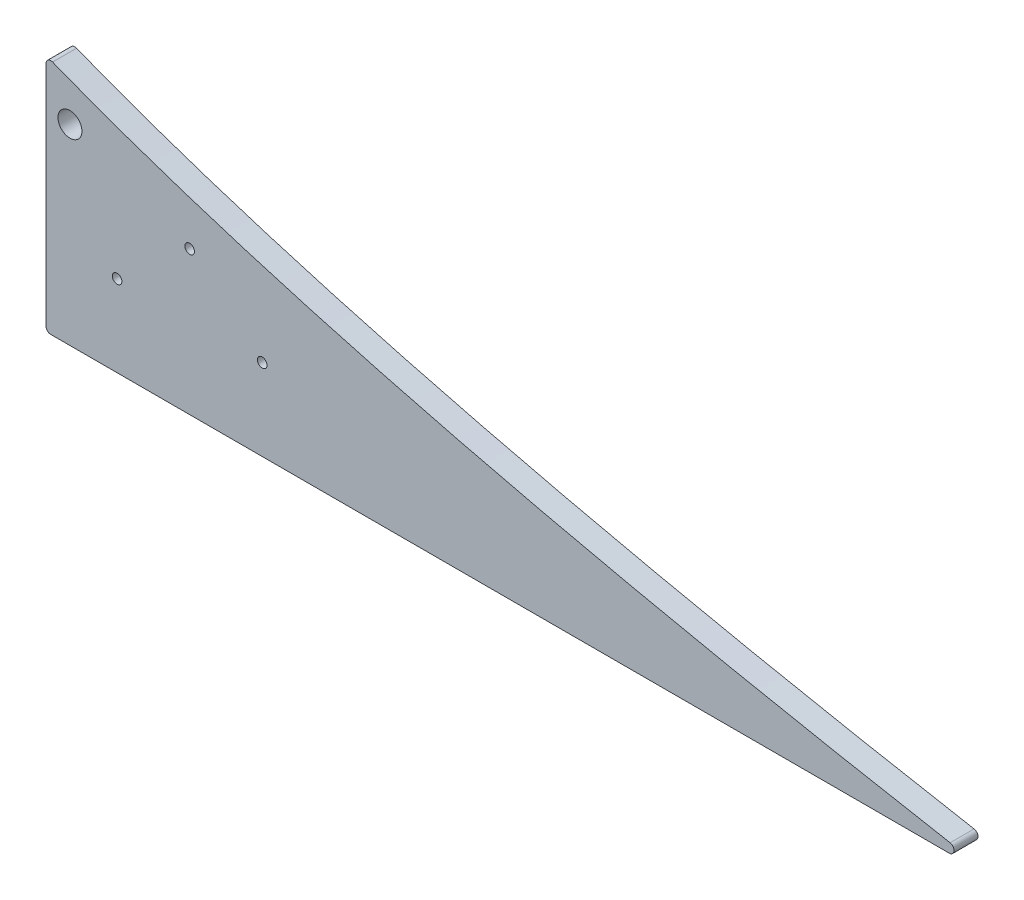
ISO-10303-21;
HEADER;
FILE_DESCRIPTION(('STEP AP214'),'2;1');
FILE_NAME('part.step','',(''),(''),'','','');
FILE_SCHEMA(('AUTOMOTIVE_DESIGN { 1 0 10303 214 1 1 1 1 }'));
ENDSEC;
DATA;
#1=APPLICATION_CONTEXT('core data for automotive mechanical design processes');
#2=APPLICATION_PROTOCOL_DEFINITION('international standard','automotive_design',2000,#1);
#3=PRODUCT_CONTEXT('',#1,'mechanical');
#4=PRODUCT('Part','Part','',(#3));
#5=PRODUCT_RELATED_PRODUCT_CATEGORY('part','',(#4));
#6=PRODUCT_DEFINITION_FORMATION('','',#4);
#7=PRODUCT_DEFINITION_CONTEXT('part definition',#1,'design');
#8=PRODUCT_DEFINITION('design','',#6,#7);
#9=PRODUCT_DEFINITION_SHAPE('','',#8);
#10=(LENGTH_UNIT() NAMED_UNIT(*) SI_UNIT(.MILLI.,.METRE.));
#11=(NAMED_UNIT(*) PLANE_ANGLE_UNIT() SI_UNIT($,.RADIAN.));
#12=(NAMED_UNIT(*) SI_UNIT($,.STERADIAN.) SOLID_ANGLE_UNIT());
#13=UNCERTAINTY_MEASURE_WITH_UNIT(LENGTH_MEASURE(1.E-05),#10,'distance_accuracy_value','');
#14=(GEOMETRIC_REPRESENTATION_CONTEXT(3) GLOBAL_UNCERTAINTY_ASSIGNED_CONTEXT((#13)) GLOBAL_UNIT_ASSIGNED_CONTEXT((#10,
#11,#12)) REPRESENTATION_CONTEXT('',''));
#15=CARTESIAN_POINT('',(0.,0.,0.));
#16=DIRECTION('',(0.,0.,1.));
#17=DIRECTION('',(1.,0.,0.));
#18=AXIS2_PLACEMENT_3D('',#15,#16,#17);
#19=CARTESIAN_POINT('',(211.923486022132,61.2903568455649,12.7));
#20=DIRECTION('',(0.,0.,-1.));
#21=DIRECTION('',(-1.,0.,0.));
#22=AXIS2_PLACEMENT_3D('',#19,#20,#21);
#23=PLANE('',#22);
#24=CARTESIAN_POINT('',(114.69116,43.20032,12.7));
#25=DIRECTION('',(0.,0.,1.));
#26=DIRECTION('',(1.,0.,0.));
#27=AXIS2_PLACEMENT_3D('',#24,#25,#26);
#28=CIRCLE('',#27,2.54);
#29=CARTESIAN_POINT('',(117.23116,43.20032,12.7));
#30=VERTEX_POINT('',#29);
#31=EDGE_CURVE('E151',#30,#30,#28,.T.);
#32=ORIENTED_EDGE('',*,*,#31,.F.);
#33=EDGE_LOOP('',(#32));
#34=FACE_BOUND('',#33,.T.);
#35=CARTESIAN_POINT('',(37.70884,43.20032,12.7));
#36=DIRECTION('',(0.,0.,1.));
#37=DIRECTION('',(1.,0.,0.));
#38=AXIS2_PLACEMENT_3D('',#35,#36,#37);
#39=CIRCLE('',#38,2.53999999999999);
#40=CARTESIAN_POINT('',(40.24884,43.20032,12.7));
#41=VERTEX_POINT('',#40);
#42=EDGE_CURVE('E141',#41,#41,#39,.T.);
#43=ORIENTED_EDGE('',*,*,#42,.F.);
#44=EDGE_LOOP('',(#43));
#45=FACE_BOUND('',#44,.T.);
#46=CARTESIAN_POINT('',(76.2,76.2,12.7));
#47=DIRECTION('',(0.,0.,1.));
#48=DIRECTION('',(1.,0.,0.));
#49=AXIS2_PLACEMENT_3D('',#46,#47,#48);
#50=CIRCLE('',#49,2.53999999999999);
#51=CARTESIAN_POINT('',(78.74,76.2,12.7));
#52=VERTEX_POINT('',#51);
#53=EDGE_CURVE('E138',#52,#52,#50,.T.);
#54=ORIENTED_EDGE('',*,*,#53,.F.);
#55=EDGE_LOOP('',(#54));
#56=FACE_BOUND('',#55,.T.);
#57=DIRECTION('',(0.,-1.,0.));
#58=VECTOR('',#57,1.);
#59=CARTESIAN_POINT('',(0.,0.,12.7));
#60=LINE('',#59,#58);
#61=CARTESIAN_POINT('',(0.,123.256640408703,12.7));
#62=VERTEX_POINT('',#61);
#63=CARTESIAN_POINT('',(0.,2.54,12.7));
#64=VERTEX_POINT('',#63);
#65=EDGE_CURVE('E104',#62,#64,#60,.T.);
#66=ORIENTED_EDGE('',*,*,#65,.T.);
#67=CARTESIAN_POINT('',(2.53999999999999,2.54,12.7));
#68=DIRECTION('',(0.,0.,-1.));
#69=DIRECTION('',(-1.,0.,0.));
#70=AXIS2_PLACEMENT_3D('',#67,#68,#69);
#71=CIRCLE('',#70,2.54);
#72=CARTESIAN_POINT('',(2.53999999999999,0.,12.7));
#73=VERTEX_POINT('',#72);
#74=EDGE_CURVE('E41',#64,#73,#71,.F.);
#75=ORIENTED_EDGE('',*,*,#74,.T.);
#76=DIRECTION('',(1.,0.,0.));
#77=VECTOR('',#76,1.);
#78=CARTESIAN_POINT('',(508.,0.,12.7));
#79=LINE('',#78,#77);
#80=CARTESIAN_POINT('',(479.099890022975,0.,12.7));
#81=VERTEX_POINT('',#80);
#82=EDGE_CURVE('E110',#73,#81,#79,.T.);
#83=ORIENTED_EDGE('',*,*,#82,.T.);
#84=CARTESIAN_POINT('',(479.099890022975,2.54000000000003,12.7));
#85=DIRECTION('',(0.,0.,-1.));
#86=DIRECTION('',(-1.,0.,0.));
#87=AXIS2_PLACEMENT_3D('',#84,#85,#86);
#88=CIRCLE('',#87,2.54);
#89=CARTESIAN_POINT('',(479.548959203002,5.03998737427818,12.7));
#90=VERTEX_POINT('',#89);
#91=EDGE_CURVE('E49',#81,#90,#88,.F.);
#92=ORIENTED_EDGE('',*,*,#91,.T.);
#93=CARTESIAN_POINT('',(508.000000000001,-1.04948429841887E-13,12.7));
#94=CARTESIAN_POINT('',(169.846972044265,59.0807136911298,12.7));
#95=CARTESIAN_POINT('',(0.,127.,12.7));
#96=B_SPLINE_CURVE_WITH_KNOTS('',2,(#93,#94,#95),.UNSPECIFIED.,.F.,.F.,(3,3),(0.,1.),.UNSPECIFIED.);
#97=CARTESIAN_POINT('',(3.47389515778096,125.6187241994,12.7));
#98=VERTEX_POINT('',#97);
#99=EDGE_CURVE('E113',#90,#98,#96,.T.);
#100=ORIENTED_EDGE('',*,*,#99,.T.);
#101=CARTESIAN_POINT('',(2.54,123.256640408703,12.7));
#102=DIRECTION('',(0.,0.,-1.));
#103=DIRECTION('',(-1.,0.,0.));
#104=AXIS2_PLACEMENT_3D('',#101,#102,#103);
#105=CIRCLE('',#104,2.54);
#106=EDGE_CURVE('E122',#98,#62,#105,.F.);
#107=ORIENTED_EDGE('',*,*,#106,.T.);
#108=EDGE_LOOP('',(#66,#75,#83,#92,#100,#107));
#109=FACE_BOUND('',#108,.T.);
#110=CARTESIAN_POINT('',(12.7,101.6,12.7));
#111=DIRECTION('',(0.,0.,1.));
#112=DIRECTION('',(1.,0.,0.));
#113=AXIS2_PLACEMENT_3D('',#110,#111,#112);
#114=CIRCLE('',#113,6.35);
#115=CARTESIAN_POINT('',(19.05,101.6,12.7));
#116=VERTEX_POINT('',#115);
#117=EDGE_CURVE('E154',#116,#116,#114,.T.);
#118=ORIENTED_EDGE('',*,*,#117,.F.);
#119=EDGE_LOOP('',(#118));
#120=FACE_BOUND('',#119,.T.);
#121=ADVANCED_FACE('F32',(#34,#45,#56,#109,#120),#23,.F.);
#122=CARTESIAN_POINT('',(211.923486022132,61.2903568455649,0.));
#123=DIRECTION('',(0.,0.,-1.));
#124=DIRECTION('',(-1.,0.,0.));
#125=AXIS2_PLACEMENT_3D('',#122,#123,#124);
#126=PLANE('',#125);
#127=CARTESIAN_POINT('',(114.69116,43.20032,0.));
#128=DIRECTION('',(0.,0.,-1.));
#129=DIRECTION('',(-1.,0.,0.));
#130=AXIS2_PLACEMENT_3D('',#127,#128,#129);
#131=CIRCLE('',#130,2.54);
#132=CARTESIAN_POINT('',(112.15116,43.20032,0.));
#133=VERTEX_POINT('',#132);
#134=EDGE_CURVE('E36',#133,#133,#131,.T.);
#135=ORIENTED_EDGE('',*,*,#134,.F.);
#136=EDGE_LOOP('',(#135));
#137=FACE_BOUND('',#136,.T.);
#138=CARTESIAN_POINT('',(37.70884,43.20032,0.));
#139=DIRECTION('',(0.,0.,-1.));
#140=DIRECTION('',(-1.,0.,0.));
#141=AXIS2_PLACEMENT_3D('',#138,#139,#140);
#142=CIRCLE('',#141,2.53999999999999);
#143=CARTESIAN_POINT('',(35.16884,43.20032,0.));
#144=VERTEX_POINT('',#143);
#145=EDGE_CURVE('E139',#144,#144,#142,.T.);
#146=ORIENTED_EDGE('',*,*,#145,.F.);
#147=EDGE_LOOP('',(#146));
#148=FACE_BOUND('',#147,.T.);
#149=CARTESIAN_POINT('',(76.2,76.2,0.));
#150=DIRECTION('',(0.,0.,-1.));
#151=DIRECTION('',(-1.,0.,0.));
#152=AXIS2_PLACEMENT_3D('',#149,#150,#151);
#153=CIRCLE('',#152,2.53999999999999);
#154=CARTESIAN_POINT('',(73.66,76.2,0.));
#155=VERTEX_POINT('',#154);
#156=EDGE_CURVE('E135',#155,#155,#153,.T.);
#157=ORIENTED_EDGE('',*,*,#156,.F.);
#158=EDGE_LOOP('',(#157));
#159=FACE_BOUND('',#158,.T.);
#160=DIRECTION('',(1.,0.,0.));
#161=VECTOR('',#160,1.);
#162=CARTESIAN_POINT('',(508.,0.,0.));
#163=LINE('',#162,#161);
#164=CARTESIAN_POINT('',(2.53999999999999,0.,0.));
#165=VERTEX_POINT('',#164);
#166=CARTESIAN_POINT('',(479.099890022975,0.,0.));
#167=VERTEX_POINT('',#166);
#168=EDGE_CURVE('E115',#165,#167,#163,.T.);
#169=ORIENTED_EDGE('',*,*,#168,.F.);
#170=CARTESIAN_POINT('',(2.53999999999999,2.54,0.));
#171=DIRECTION('',(0.,0.,-1.));
#172=DIRECTION('',(-1.,0.,0.));
#173=AXIS2_PLACEMENT_3D('',#170,#171,#172);
#174=CIRCLE('',#173,2.54);
#175=CARTESIAN_POINT('',(0.,2.54,0.));
#176=VERTEX_POINT('',#175);
#177=EDGE_CURVE('E109',#165,#176,#174,.T.);
#178=ORIENTED_EDGE('',*,*,#177,.T.);
#179=DIRECTION('',(0.,-1.,0.));
#180=VECTOR('',#179,1.);
#181=CARTESIAN_POINT('',(0.,0.,0.));
#182=LINE('',#181,#180);
#183=CARTESIAN_POINT('',(0.,123.256640408703,0.));
#184=VERTEX_POINT('',#183);
#185=EDGE_CURVE('E103',#184,#176,#182,.T.);
#186=ORIENTED_EDGE('',*,*,#185,.F.);
#187=CARTESIAN_POINT('',(2.54,123.256640408703,0.));
#188=DIRECTION('',(0.,0.,-1.));
#189=DIRECTION('',(-1.,0.,0.));
#190=AXIS2_PLACEMENT_3D('',#187,#188,#189);
#191=CIRCLE('',#190,2.54);
#192=CARTESIAN_POINT('',(3.47389515778096,125.6187241994,0.));
#193=VERTEX_POINT('',#192);
#194=EDGE_CURVE('E91',#184,#193,#191,.T.);
#195=ORIENTED_EDGE('',*,*,#194,.T.);
#196=CARTESIAN_POINT('',(508.000000000001,-1.04948429841887E-13,0.));
#197=CARTESIAN_POINT('',(169.846972044265,59.0807136911298,0.));
#198=CARTESIAN_POINT('',(0.,127.,0.));
#199=B_SPLINE_CURVE_WITH_KNOTS('',2,(#196,#197,#198),.UNSPECIFIED.,.F.,.F.,(3,3),(0.,1.),.UNSPECIFIED.);
#200=CARTESIAN_POINT('',(479.548959203001,5.03998737427819,0.));
#201=VERTEX_POINT('',#200);
#202=EDGE_CURVE('E111',#201,#193,#199,.T.);
#203=ORIENTED_EDGE('',*,*,#202,.F.);
#204=CARTESIAN_POINT('',(479.099890022975,2.54000000000003,0.));
#205=DIRECTION('',(0.,0.,-1.));
#206=DIRECTION('',(-1.,0.,0.));
#207=AXIS2_PLACEMENT_3D('',#204,#205,#206);
#208=CIRCLE('',#207,2.54);
#209=EDGE_CURVE('E129',#201,#167,#208,.T.);
#210=ORIENTED_EDGE('',*,*,#209,.T.);
#211=EDGE_LOOP('',(#169,#178,#186,#195,#203,#210));
#212=FACE_BOUND('',#211,.T.);
#213=CARTESIAN_POINT('',(12.7,101.6,0.));
#214=DIRECTION('',(0.,0.,1.));
#215=DIRECTION('',(1.,0.,0.));
#216=AXIS2_PLACEMENT_3D('',#213,#214,#215);
#217=CIRCLE('',#216,6.35);
#218=CARTESIAN_POINT('',(19.05,101.6,0.));
#219=VERTEX_POINT('',#218);
#220=EDGE_CURVE('E137',#219,#219,#217,.T.);
#221=ORIENTED_EDGE('',*,*,#220,.T.);
#222=EDGE_LOOP('',(#221));
#223=FACE_BOUND('',#222,.T.);
#224=ADVANCED_FACE('F107',(#137,#148,#159,#212,#223),#126,.T.);
#225=CARTESIAN_POINT('',(508.,0.,12.7));
#226=DIRECTION('',(0.,1.,0.));
#227=DIRECTION('',(-1.,0.,0.));
#228=AXIS2_PLACEMENT_3D('',#225,#226,#227);
#229=PLANE('',#228);
#230=ORIENTED_EDGE('',*,*,#82,.F.);
#231=DIRECTION('',(0.,0.,-1.));
#232=VECTOR('',#231,1.);
#233=CARTESIAN_POINT('',(2.53999999999999,0.,12.7));
#234=LINE('',#233,#232);
#235=EDGE_CURVE('E126',#73,#165,#234,.T.);
#236=ORIENTED_EDGE('',*,*,#235,.T.);
#237=ORIENTED_EDGE('',*,*,#168,.T.);
#238=DIRECTION('',(0.,0.,-1.));
#239=VECTOR('',#238,1.);
#240=CARTESIAN_POINT('',(479.099890022975,0.,12.7));
#241=LINE('',#240,#239);
#242=EDGE_CURVE('E124',#167,#81,#241,.F.);
#243=ORIENTED_EDGE('',*,*,#242,.T.);
#244=EDGE_LOOP('',(#230,#236,#237,#243));
#245=FACE_BOUND('',#244,.T.);
#246=ADVANCED_FACE('F171',(#245),#229,.F.);
#247=DIRECTION('',(0.,0.,-1.));
#248=VECTOR('',#247,1.);
#249=SURFACE_OF_LINEAR_EXTRUSION('',#96,#248);
#250=ORIENTED_EDGE('',*,*,#99,.F.);
#251=DIRECTION('',(0.,0.,-1.));
#252=VECTOR('',#251,1.);
#253=CARTESIAN_POINT('',(479.548959203002,5.03998737427818,12.7));
#254=LINE('',#253,#252);
#255=EDGE_CURVE('E11',#90,#201,#254,.T.);
#256=ORIENTED_EDGE('',*,*,#255,.T.);
#257=ORIENTED_EDGE('',*,*,#202,.T.);
#258=DIRECTION('',(0.,0.,-1.));
#259=VECTOR('',#258,1.);
#260=CARTESIAN_POINT('',(3.47389515778077,125.6187241994,0.));
#261=LINE('',#260,#259);
#262=EDGE_CURVE('E97',#193,#98,#261,.F.);
#263=ORIENTED_EDGE('',*,*,#262,.T.);
#264=EDGE_LOOP('',(#250,#256,#257,#263));
#265=FACE_BOUND('',#264,.T.);
#266=ADVANCED_FACE('F167',(#265),#249,.F.);
#267=CARTESIAN_POINT('',(0.,0.,12.7));
#268=DIRECTION('',(1.,0.,0.));
#269=DIRECTION('',(0.,0.,-1.));
#270=AXIS2_PLACEMENT_3D('',#267,#268,#269);
#271=PLANE('',#270);
#272=ORIENTED_EDGE('',*,*,#185,.T.);
#273=DIRECTION('',(0.,0.,-1.));
#274=VECTOR('',#273,1.);
#275=CARTESIAN_POINT('',(0.,2.54,12.7));
#276=LINE('',#275,#274);
#277=EDGE_CURVE('E57',#176,#64,#276,.F.);
#278=ORIENTED_EDGE('',*,*,#277,.T.);
#279=ORIENTED_EDGE('',*,*,#65,.F.);
#280=DIRECTION('',(0.,0.,-1.));
#281=VECTOR('',#280,1.);
#282=CARTESIAN_POINT('',(0.,123.256640408703,12.7));
#283=LINE('',#282,#281);
#284=EDGE_CURVE('E95',#62,#184,#283,.T.);
#285=ORIENTED_EDGE('',*,*,#284,.T.);
#286=EDGE_LOOP('',(#272,#278,#279,#285));
#287=FACE_BOUND('',#286,.T.);
#288=ADVANCED_FACE('F102',(#287),#271,.F.);
#289=CARTESIAN_POINT('',(12.7,101.6,12.7));
#290=DIRECTION('',(0.,0.,-1.));
#291=DIRECTION('',(-1.,0.,0.));
#292=AXIS2_PLACEMENT_3D('',#289,#290,#291);
#293=CYLINDRICAL_SURFACE('',#292,6.35);
#294=ORIENTED_EDGE('',*,*,#117,.T.);
#295=EDGE_LOOP('',(#294));
#296=FACE_BOUND('',#295,.T.);
#297=ORIENTED_EDGE('',*,*,#220,.F.);
#298=EDGE_LOOP('',(#297));
#299=FACE_BOUND('',#298,.T.);
#300=ADVANCED_FACE('F179',(#296,#299),#293,.F.);
#301=CARTESIAN_POINT('',(2.54,123.256640408703,6.35));
#302=DIRECTION('',(0.,0.,-1.));
#303=DIRECTION('',(-1.,0.,0.));
#304=AXIS2_PLACEMENT_3D('',#301,#302,#303);
#305=CYLINDRICAL_SURFACE('',#304,2.54);
#306=ORIENTED_EDGE('',*,*,#106,.F.);
#307=ORIENTED_EDGE('',*,*,#262,.F.);
#308=ORIENTED_EDGE('',*,*,#194,.F.);
#309=ORIENTED_EDGE('',*,*,#284,.F.);
#310=EDGE_LOOP('',(#306,#307,#308,#309));
#311=FACE_BOUND('',#310,.T.);
#312=ADVANCED_FACE('F94',(#311),#305,.T.);
#313=CARTESIAN_POINT('',(2.53999999999999,2.54,12.7));
#314=DIRECTION('',(0.,0.,-1.));
#315=DIRECTION('',(-1.,0.,0.));
#316=AXIS2_PLACEMENT_3D('',#313,#314,#315);
#317=CYLINDRICAL_SURFACE('',#316,2.54);
#318=ORIENTED_EDGE('',*,*,#74,.F.);
#319=ORIENTED_EDGE('',*,*,#277,.F.);
#320=ORIENTED_EDGE('',*,*,#177,.F.);
#321=ORIENTED_EDGE('',*,*,#235,.F.);
#322=EDGE_LOOP('',(#318,#319,#320,#321));
#323=FACE_BOUND('',#322,.T.);
#324=ADVANCED_FACE('F178',(#323),#317,.T.);
#325=CARTESIAN_POINT('',(479.099890022975,2.54000000000003,6.35));
#326=DIRECTION('',(0.,0.,-1.));
#327=DIRECTION('',(-1.,0.,0.));
#328=AXIS2_PLACEMENT_3D('',#325,#326,#327);
#329=CYLINDRICAL_SURFACE('',#328,2.54);
#330=ORIENTED_EDGE('',*,*,#91,.F.);
#331=ORIENTED_EDGE('',*,*,#242,.F.);
#332=ORIENTED_EDGE('',*,*,#209,.F.);
#333=ORIENTED_EDGE('',*,*,#255,.F.);
#334=EDGE_LOOP('',(#330,#331,#332,#333));
#335=FACE_BOUND('',#334,.T.);
#336=ADVANCED_FACE('F34',(#335),#329,.T.);
#337=CARTESIAN_POINT('',(76.2,76.2,-190.5));
#338=DIRECTION('',(0.,0.,1.));
#339=DIRECTION('',(1.,0.,0.));
#340=AXIS2_PLACEMENT_3D('',#337,#338,#339);
#341=CYLINDRICAL_SURFACE('',#340,2.53999999999999);
#342=ORIENTED_EDGE('',*,*,#156,.T.);
#343=EDGE_LOOP('',(#342));
#344=FACE_BOUND('',#343,.T.);
#345=ORIENTED_EDGE('',*,*,#53,.T.);
#346=EDGE_LOOP('',(#345));
#347=FACE_BOUND('',#346,.T.);
#348=ADVANCED_FACE('F185',(#344,#347),#341,.F.);
#349=CARTESIAN_POINT('',(37.70884,43.20032,-190.5));
#350=DIRECTION('',(0.,0.,1.));
#351=DIRECTION('',(1.,0.,0.));
#352=AXIS2_PLACEMENT_3D('',#349,#350,#351);
#353=CYLINDRICAL_SURFACE('',#352,2.53999999999999);
#354=ORIENTED_EDGE('',*,*,#145,.T.);
#355=EDGE_LOOP('',(#354));
#356=FACE_BOUND('',#355,.T.);
#357=ORIENTED_EDGE('',*,*,#42,.T.);
#358=EDGE_LOOP('',(#357));
#359=FACE_BOUND('',#358,.T.);
#360=ADVANCED_FACE('F203',(#356,#359),#353,.F.);
#361=CARTESIAN_POINT('',(114.69116,43.20032,-190.5));
#362=DIRECTION('',(0.,0.,1.));
#363=DIRECTION('',(1.,0.,0.));
#364=AXIS2_PLACEMENT_3D('',#361,#362,#363);
#365=CYLINDRICAL_SURFACE('',#364,2.54);
#366=ORIENTED_EDGE('',*,*,#134,.T.);
#367=EDGE_LOOP('',(#366));
#368=FACE_BOUND('',#367,.T.);
#369=ORIENTED_EDGE('',*,*,#31,.T.);
#370=EDGE_LOOP('',(#369));
#371=FACE_BOUND('',#370,.T.);
#372=ADVANCED_FACE('F207',(#368,#371),#365,.F.);
#373=CLOSED_SHELL('',(#121,#224,#246,#266,#288,#300,#312,#324,#336,#348,#360,#372));
#374=MANIFOLD_SOLID_BREP('B2',#373);
#375=ADVANCED_BREP_SHAPE_REPRESENTATION('',(#18,#374),#14);
#376=SHAPE_DEFINITION_REPRESENTATION(#9,#375);
ENDSEC;
END-ISO-10303-21;
